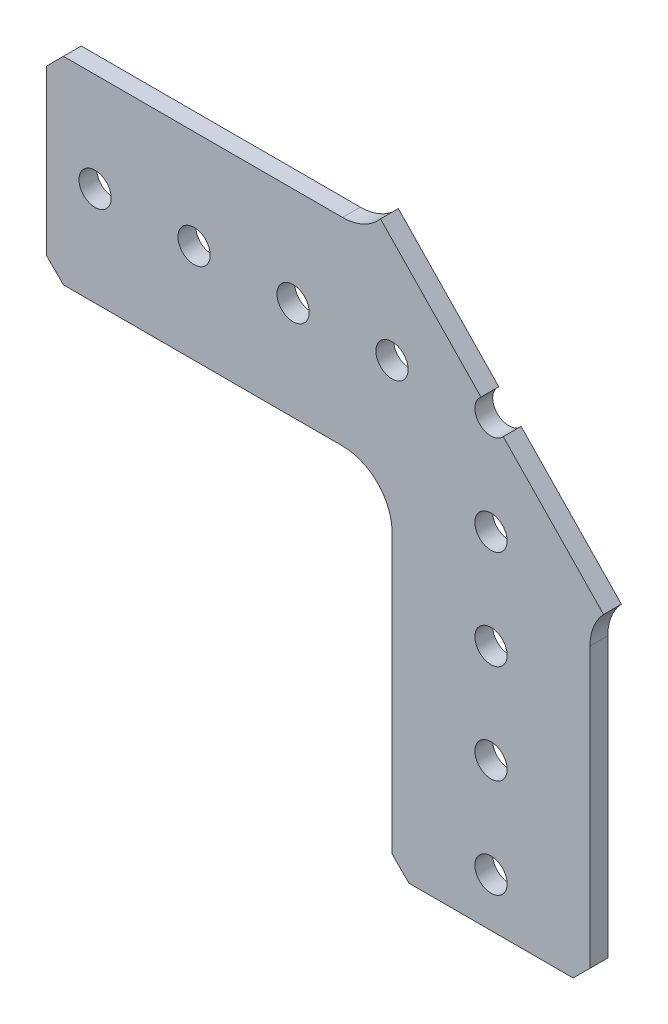
ISO-10303-21;
HEADER;
FILE_DESCRIPTION(('STEP AP214'),'2;1');
FILE_NAME('part.step','',(''),(''),'','','');
FILE_SCHEMA(('AUTOMOTIVE_DESIGN { 1 0 10303 214 1 1 1 1 }'));
ENDSEC;
DATA;
#1=APPLICATION_CONTEXT('core data for automotive mechanical design processes');
#2=APPLICATION_PROTOCOL_DEFINITION('international standard','automotive_design',2000,#1);
#3=PRODUCT_CONTEXT('',#1,'mechanical');
#4=PRODUCT('Part','Part','',(#3));
#5=PRODUCT_RELATED_PRODUCT_CATEGORY('part','',(#4));
#6=PRODUCT_DEFINITION_FORMATION('','',#4);
#7=PRODUCT_DEFINITION_CONTEXT('part definition',#1,'design');
#8=PRODUCT_DEFINITION('design','',#6,#7);
#9=PRODUCT_DEFINITION_SHAPE('','',#8);
#10=(LENGTH_UNIT() NAMED_UNIT(*) SI_UNIT(.MILLI.,.METRE.));
#11=(NAMED_UNIT(*) PLANE_ANGLE_UNIT() SI_UNIT($,.RADIAN.));
#12=(NAMED_UNIT(*) SI_UNIT($,.STERADIAN.) SOLID_ANGLE_UNIT());
#13=UNCERTAINTY_MEASURE_WITH_UNIT(LENGTH_MEASURE(1.E-05),#10,'distance_accuracy_value','');
#14=(GEOMETRIC_REPRESENTATION_CONTEXT(3) GLOBAL_UNCERTAINTY_ASSIGNED_CONTEXT((#13)) GLOBAL_UNIT_ASSIGNED_CONTEXT((#10,
#11,#12)) REPRESENTATION_CONTEXT('',''));
#15=CARTESIAN_POINT('',(0.,0.,0.));
#16=DIRECTION('',(0.,0.,1.));
#17=DIRECTION('',(1.,0.,0.));
#18=AXIS2_PLACEMENT_3D('',#15,#16,#17);
#19=CARTESIAN_POINT('',(69.723,0.,2.286));
#20=DIRECTION('',(0.,0.,-1.));
#21=DIRECTION('',(-1.,0.,0.));
#22=AXIS2_PLACEMENT_3D('',#19,#20,#21);
#23=PLANE('',#22);
#24=CARTESIAN_POINT('',(-12.7,0.,2.286));
#25=DIRECTION('',(0.,0.,-1.));
#26=DIRECTION('',(-1.,0.,0.));
#27=AXIS2_PLACEMENT_3D('',#24,#25,#26);
#28=CIRCLE('',#27,2.0701);
#29=CARTESIAN_POINT('',(-14.7701,0.,2.286));
#30=VERTEX_POINT('',#29);
#31=EDGE_CURVE('E184',#30,#30,#28,.T.);
#32=ORIENTED_EDGE('',*,*,#31,.T.);
#33=EDGE_LOOP('',(#32));
#34=FACE_BOUND('',#33,.T.);
#35=CARTESIAN_POINT('',(-38.1,0.,2.286));
#36=DIRECTION('',(0.,0.,-1.));
#37=DIRECTION('',(-1.,0.,0.));
#38=AXIS2_PLACEMENT_3D('',#35,#36,#37);
#39=CIRCLE('',#38,2.0701);
#40=CARTESIAN_POINT('',(-40.1701,0.,2.286));
#41=VERTEX_POINT('',#40);
#42=EDGE_CURVE('E187',#41,#41,#39,.T.);
#43=ORIENTED_EDGE('',*,*,#42,.T.);
#44=EDGE_LOOP('',(#43));
#45=FACE_BOUND('',#44,.T.);
#46=CARTESIAN_POINT('',(3.9907631702977E-13,-38.1,2.286));
#47=DIRECTION('',(0.,0.,-1.));
#48=DIRECTION('',(-1.,0.,0.));
#49=AXIS2_PLACEMENT_3D('',#46,#47,#48);
#50=CIRCLE('',#49,2.0701);
#51=CARTESIAN_POINT('',(-2.0700999999996,-38.1,2.286));
#52=VERTEX_POINT('',#51);
#53=EDGE_CURVE('E190',#52,#52,#50,.T.);
#54=ORIENTED_EDGE('',*,*,#53,.T.);
#55=EDGE_LOOP('',(#54));
#56=FACE_BOUND('',#55,.T.);
#57=CARTESIAN_POINT('',(1.33025439009923E-13,-12.7,2.286));
#58=DIRECTION('',(0.,0.,-1.));
#59=DIRECTION('',(-1.,0.,0.));
#60=AXIS2_PLACEMENT_3D('',#57,#58,#59);
#61=CIRCLE('',#60,2.0701);
#62=CARTESIAN_POINT('',(-2.07009999999987,-12.7,2.286));
#63=VERTEX_POINT('',#62);
#64=EDGE_CURVE('E193',#63,#63,#61,.T.);
#65=ORIENTED_EDGE('',*,*,#64,.T.);
#66=EDGE_LOOP('',(#65));
#67=FACE_BOUND('',#66,.T.);
#68=CARTESIAN_POINT('',(19.05,-19.05,2.286));
#69=DIRECTION('',(0.,0.,1.));
#70=DIRECTION('',(1.,0.,0.));
#71=AXIS2_PLACEMENT_3D('',#68,#69,#70);
#72=CIRCLE('',#71,6.35000000000001);
#73=CARTESIAN_POINT('',(12.7,-19.05,2.286));
#74=VERTEX_POINT('',#73);
#75=CARTESIAN_POINT('',(14.4449223077904,-14.6778427008267,2.286));
#76=VERTEX_POINT('',#75);
#77=EDGE_CURVE('E181',#74,#76,#72,.F.);
#78=ORIENTED_EDGE('',*,*,#77,.T.);
#79=DIRECTION('',(0.694505341103961,-0.719487547618492,0.));
#80=VECTOR('',#79,1.);
#81=CARTESIAN_POINT('',(-45.3800796503522,47.2991377450189,2.286));
#82=LINE('',#81,#80);
#83=CARTESIAN_POINT('',(1.57428143612047,-1.34422913593125,2.286));
#84=VERTEX_POINT('',#83);
#85=EDGE_CURVE('E162',#84,#76,#82,.T.);
#86=ORIENTED_EDGE('',*,*,#85,.F.);
#87=CARTESIAN_POINT('',(0.,0.,2.286));
#88=DIRECTION('',(0.,0.,-1.));
#89=DIRECTION('',(-1.,0.,0.));
#90=AXIS2_PLACEMENT_3D('',#87,#88,#89);
#91=CIRCLE('',#90,2.0701);
#92=CARTESIAN_POINT('',(-1.28777922803728,1.62078335067821,2.286));
#93=VERTEX_POINT('',#92);
#94=EDGE_CURVE('E161',#84,#93,#91,.T.);
#95=ORIENTED_EDGE('',*,*,#94,.T.);
#96=CARTESIAN_POINT('',(-14.1792157014069,14.9759405605,2.286));
#97=VERTEX_POINT('',#96);
#98=EDGE_CURVE('E146',#97,#93,#82,.T.);
#99=ORIENTED_EDGE('',*,*,#98,.F.);
#100=CARTESIAN_POINT('',(-19.05,19.05,2.286));
#101=DIRECTION('',(0.,0.,1.));
#102=DIRECTION('',(1.,0.,0.));
#103=AXIS2_PLACEMENT_3D('',#100,#101,#102);
#104=CIRCLE('',#103,6.35000000000001);
#105=CARTESIAN_POINT('',(-19.05,12.7,2.286));
#106=VERTEX_POINT('',#105);
#107=EDGE_CURVE('E157',#97,#106,#104,.F.);
#108=ORIENTED_EDGE('',*,*,#107,.T.);
#109=DIRECTION('',(1.,0.,0.));
#110=VECTOR('',#109,1.);
#111=CARTESIAN_POINT('',(0.,12.7,2.286));
#112=LINE('',#111,#110);
#113=CARTESIAN_POINT('',(-54.864,12.7,2.286));
#114=VERTEX_POINT('',#113);
#115=EDGE_CURVE('E172',#114,#106,#112,.T.);
#116=ORIENTED_EDGE('',*,*,#115,.F.);
#117=DIRECTION('',(-0.707106781186548,-0.707106781186548,0.));
#118=VECTOR('',#117,1.);
#119=CARTESIAN_POINT('',(-57.023,10.541,2.286));
#120=LINE('',#119,#118);
#121=CARTESIAN_POINT('',(-57.023,10.541,2.286));
#122=VERTEX_POINT('',#121);
#123=EDGE_CURVE('E258',#122,#114,#120,.F.);
#124=ORIENTED_EDGE('',*,*,#123,.F.);
#125=DIRECTION('',(0.,1.,0.));
#126=VECTOR('',#125,1.);
#127=CARTESIAN_POINT('',(-57.023,-12.7,2.286));
#128=LINE('',#127,#126);
#129=CARTESIAN_POINT('',(-57.023,-10.5409999999998,2.286));
#130=VERTEX_POINT('',#129);
#131=EDGE_CURVE('E267',#122,#130,#128,.F.);
#132=ORIENTED_EDGE('',*,*,#131,.T.);
#133=DIRECTION('',(-0.707106781186547,0.707106781186548,0.));
#134=VECTOR('',#133,1.);
#135=CARTESIAN_POINT('',(-54.864,-12.6999999999998,2.286));
#136=LINE('',#135,#134);
#137=CARTESIAN_POINT('',(-54.864,-12.6999999999998,2.286));
#138=VERTEX_POINT('',#137);
#139=EDGE_CURVE('E276',#130,#138,#136,.F.);
#140=ORIENTED_EDGE('',*,*,#139,.T.);
#141=DIRECTION('',(-1.,0.,0.));
#142=VECTOR('',#141,1.);
#143=CARTESIAN_POINT('',(0.,-12.7,2.286));
#144=LINE('',#143,#142);
#145=CARTESIAN_POINT('',(-19.05,-12.6999999999999,2.286));
#146=VERTEX_POINT('',#145);
#147=EDGE_CURVE('E277',#138,#146,#144,.F.);
#148=ORIENTED_EDGE('',*,*,#147,.T.);
#149=CARTESIAN_POINT('',(-19.0500000000001,-19.0499999999999,2.286));
#150=DIRECTION('',(0.,0.,1.));
#151=DIRECTION('',(1.,0.,0.));
#152=AXIS2_PLACEMENT_3D('',#149,#150,#151);
#153=CIRCLE('',#152,6.35000000000001);
#154=CARTESIAN_POINT('',(-12.7,-19.0499999999999,2.286));
#155=VERTEX_POINT('',#154);
#156=EDGE_CURVE('E176',#146,#155,#153,.F.);
#157=ORIENTED_EDGE('',*,*,#156,.T.);
#158=DIRECTION('',(0.,-1.,0.));
#159=VECTOR('',#158,1.);
#160=CARTESIAN_POINT('',(-12.7,0.,2.286));
#161=LINE('',#160,#159);
#162=CARTESIAN_POINT('',(-12.7000000000002,-54.864,2.286));
#163=VERTEX_POINT('',#162);
#164=EDGE_CURVE('E282',#163,#155,#161,.F.);
#165=ORIENTED_EDGE('',*,*,#164,.F.);
#166=DIRECTION('',(0.707106781186546,-0.707106781186549,0.));
#167=VECTOR('',#166,1.);
#168=CARTESIAN_POINT('',(-10.5410000000002,-57.023,2.286));
#169=LINE('',#168,#167);
#170=CARTESIAN_POINT('',(-10.5410000000002,-57.023,2.286));
#171=VERTEX_POINT('',#170);
#172=EDGE_CURVE('E296',#171,#163,#169,.F.);
#173=ORIENTED_EDGE('',*,*,#172,.F.);
#174=DIRECTION('',(-1.,0.,0.));
#175=VECTOR('',#174,1.);
#176=CARTESIAN_POINT('',(12.7,-57.023,2.286));
#177=LINE('',#176,#175);
#178=CARTESIAN_POINT('',(10.541,-57.023,2.286));
#179=VERTEX_POINT('',#178);
#180=EDGE_CURVE('E305',#171,#179,#177,.F.);
#181=ORIENTED_EDGE('',*,*,#180,.T.);
#182=DIRECTION('',(-0.707106781186547,-0.707106781186548,0.));
#183=VECTOR('',#182,1.);
#184=CARTESIAN_POINT('',(12.7,-54.864,2.286));
#185=LINE('',#184,#183);
#186=CARTESIAN_POINT('',(12.7,-54.864,2.286));
#187=VERTEX_POINT('',#186);
#188=EDGE_CURVE('E314',#179,#187,#185,.F.);
#189=ORIENTED_EDGE('',*,*,#188,.T.);
#190=DIRECTION('',(0.,-1.,0.));
#191=VECTOR('',#190,1.);
#192=CARTESIAN_POINT('',(12.7,0.,2.286));
#193=LINE('',#192,#191);
#194=EDGE_CURVE('E315',#187,#74,#193,.F.);
#195=ORIENTED_EDGE('',*,*,#194,.T.);
#196=EDGE_LOOP('',(#78,#86,#95,#99,#108,#116,#124,#132,#140,#148,#157,#165,#173,#181,#189,#195));
#197=FACE_BOUND('',#196,.T.);
#198=CARTESIAN_POINT('',(2.66050878019847E-13,-25.4,2.286));
#199=DIRECTION('',(0.,0.,-1.));
#200=DIRECTION('',(-1.,0.,0.));
#201=AXIS2_PLACEMENT_3D('',#198,#199,#200);
#202=CIRCLE('',#201,2.0701);
#203=CARTESIAN_POINT('',(-2.07009999999973,-25.4,2.286));
#204=VERTEX_POINT('',#203);
#205=EDGE_CURVE('E197',#204,#204,#202,.T.);
#206=ORIENTED_EDGE('',*,*,#205,.T.);
#207=EDGE_LOOP('',(#206));
#208=FACE_BOUND('',#207,.T.);
#209=CARTESIAN_POINT('',(0.,-50.8,2.286));
#210=DIRECTION('',(0.,0.,-1.));
#211=DIRECTION('',(-1.,0.,0.));
#212=AXIS2_PLACEMENT_3D('',#209,#210,#211);
#213=CIRCLE('',#212,2.0701);
#214=CARTESIAN_POINT('',(-2.07009999999999,-50.8,2.286));
#215=VERTEX_POINT('',#214);
#216=EDGE_CURVE('E200',#215,#215,#213,.T.);
#217=ORIENTED_EDGE('',*,*,#216,.T.);
#218=EDGE_LOOP('',(#217));
#219=FACE_BOUND('',#218,.T.);
#220=CARTESIAN_POINT('',(-50.8,0.,2.286));
#221=DIRECTION('',(0.,0.,-1.));
#222=DIRECTION('',(-1.,0.,0.));
#223=AXIS2_PLACEMENT_3D('',#220,#221,#222);
#224=CIRCLE('',#223,2.0701);
#225=CARTESIAN_POINT('',(-52.8701,0.,2.286));
#226=VERTEX_POINT('',#225);
#227=EDGE_CURVE('E203',#226,#226,#224,.T.);
#228=ORIENTED_EDGE('',*,*,#227,.T.);
#229=EDGE_LOOP('',(#228));
#230=FACE_BOUND('',#229,.T.);
#231=CARTESIAN_POINT('',(-25.4,0.,2.286));
#232=DIRECTION('',(0.,0.,-1.));
#233=DIRECTION('',(-1.,0.,0.));
#234=AXIS2_PLACEMENT_3D('',#231,#232,#233);
#235=CIRCLE('',#234,2.0701);
#236=CARTESIAN_POINT('',(-27.4701,0.,2.286));
#237=VERTEX_POINT('',#236);
#238=EDGE_CURVE('E205',#237,#237,#235,.T.);
#239=ORIENTED_EDGE('',*,*,#238,.T.);
#240=EDGE_LOOP('',(#239));
#241=FACE_BOUND('',#240,.T.);
#242=ADVANCED_FACE('F34',(#34,#45,#56,#67,#197,#208,#219,#230,#241),#23,.F.);
#243=CARTESIAN_POINT('',(-25.4,0.,2.286));
#244=DIRECTION('',(0.,0.,-1.));
#245=DIRECTION('',(-1.,0.,0.));
#246=AXIS2_PLACEMENT_3D('',#243,#244,#245);
#247=CYLINDRICAL_SURFACE('',#246,2.0701);
#248=ORIENTED_EDGE('',*,*,#238,.F.);
#249=EDGE_LOOP('',(#248));
#250=FACE_BOUND('',#249,.T.);
#251=CARTESIAN_POINT('',(-25.4,0.,0.));
#252=DIRECTION('',(0.,0.,-1.));
#253=DIRECTION('',(-1.,0.,0.));
#254=AXIS2_PLACEMENT_3D('',#251,#252,#253);
#255=CIRCLE('',#254,2.0701);
#256=CARTESIAN_POINT('',(-27.4701,0.,0.));
#257=VERTEX_POINT('',#256);
#258=EDGE_CURVE('E167',#257,#257,#255,.F.);
#259=ORIENTED_EDGE('',*,*,#258,.F.);
#260=EDGE_LOOP('',(#259));
#261=FACE_BOUND('',#260,.T.);
#262=ADVANCED_FACE('F386',(#250,#261),#247,.F.);
#263=CARTESIAN_POINT('',(-50.8,0.,2.286));
#264=DIRECTION('',(0.,0.,-1.));
#265=DIRECTION('',(-1.,0.,0.));
#266=AXIS2_PLACEMENT_3D('',#263,#264,#265);
#267=CYLINDRICAL_SURFACE('',#266,2.0701);
#268=ORIENTED_EDGE('',*,*,#227,.F.);
#269=EDGE_LOOP('',(#268));
#270=FACE_BOUND('',#269,.T.);
#271=CARTESIAN_POINT('',(-50.8,0.,0.));
#272=DIRECTION('',(0.,0.,-1.));
#273=DIRECTION('',(-1.,0.,0.));
#274=AXIS2_PLACEMENT_3D('',#271,#272,#273);
#275=CIRCLE('',#274,2.0701);
#276=CARTESIAN_POINT('',(-52.8701,0.,0.));
#277=VERTEX_POINT('',#276);
#278=EDGE_CURVE('E170',#277,#277,#275,.F.);
#279=ORIENTED_EDGE('',*,*,#278,.F.);
#280=EDGE_LOOP('',(#279));
#281=FACE_BOUND('',#280,.T.);
#282=ADVANCED_FACE('F383',(#270,#281),#267,.F.);
#283=CARTESIAN_POINT('',(0.,-50.8,2.286));
#284=DIRECTION('',(0.,0.,-1.));
#285=DIRECTION('',(-1.,0.,0.));
#286=AXIS2_PLACEMENT_3D('',#283,#284,#285);
#287=CYLINDRICAL_SURFACE('',#286,2.0701);
#288=ORIENTED_EDGE('',*,*,#216,.F.);
#289=EDGE_LOOP('',(#288));
#290=FACE_BOUND('',#289,.T.);
#291=CARTESIAN_POINT('',(0.,-50.8,0.));
#292=DIRECTION('',(0.,0.,-1.));
#293=DIRECTION('',(-1.,0.,0.));
#294=AXIS2_PLACEMENT_3D('',#291,#292,#293);
#295=CIRCLE('',#294,2.0701);
#296=CARTESIAN_POINT('',(-2.07009999999999,-50.8,0.));
#297=VERTEX_POINT('',#296);
#298=EDGE_CURVE('E375',#297,#297,#295,.F.);
#299=ORIENTED_EDGE('',*,*,#298,.F.);
#300=EDGE_LOOP('',(#299));
#301=FACE_BOUND('',#300,.T.);
#302=ADVANCED_FACE('F385',(#290,#301),#287,.F.);
#303=CARTESIAN_POINT('',(2.66050878019847E-13,-25.4,2.286));
#304=DIRECTION('',(0.,0.,-1.));
#305=DIRECTION('',(-1.,0.,0.));
#306=AXIS2_PLACEMENT_3D('',#303,#304,#305);
#307=CYLINDRICAL_SURFACE('',#306,2.0701);
#308=ORIENTED_EDGE('',*,*,#205,.F.);
#309=EDGE_LOOP('',(#308));
#310=FACE_BOUND('',#309,.T.);
#311=CARTESIAN_POINT('',(2.66050878019847E-13,-25.4,0.));
#312=DIRECTION('',(0.,0.,-1.));
#313=DIRECTION('',(-1.,0.,0.));
#314=AXIS2_PLACEMENT_3D('',#311,#312,#313);
#315=CIRCLE('',#314,2.0701);
#316=CARTESIAN_POINT('',(-2.07009999999973,-25.4,0.));
#317=VERTEX_POINT('',#316);
#318=EDGE_CURVE('E372',#317,#317,#315,.F.);
#319=ORIENTED_EDGE('',*,*,#318,.F.);
#320=EDGE_LOOP('',(#319));
#321=FACE_BOUND('',#320,.T.);
#322=ADVANCED_FACE('F394',(#310,#321),#307,.F.);
#323=CARTESIAN_POINT('',(0.,0.,2.286));
#324=DIRECTION('',(0.,0.,-1.));
#325=DIRECTION('',(-1.,0.,0.));
#326=AXIS2_PLACEMENT_3D('',#323,#324,#325);
#327=CYLINDRICAL_SURFACE('',#326,2.0701);
#328=CARTESIAN_POINT('',(0.,0.,0.));
#329=DIRECTION('',(0.,0.,-1.));
#330=DIRECTION('',(-1.,0.,0.));
#331=AXIS2_PLACEMENT_3D('',#328,#329,#330);
#332=CIRCLE('',#331,2.0701);
#333=CARTESIAN_POINT('',(-1.2877792280373,1.6207833506782,0.));
#334=VERTEX_POINT('',#333);
#335=CARTESIAN_POINT('',(1.57428143612045,-1.34422913593127,0.));
#336=VERTEX_POINT('',#335);
#337=EDGE_CURVE('E370',#334,#336,#332,.F.);
#338=ORIENTED_EDGE('',*,*,#337,.F.);
#339=DIRECTION('',(0.,0.,-1.));
#340=VECTOR('',#339,1.);
#341=CARTESIAN_POINT('',(-1.28777922803729,1.62078335067821,2.286));
#342=LINE('',#341,#340);
#343=EDGE_CURVE('E48',#334,#93,#342,.F.);
#344=ORIENTED_EDGE('',*,*,#343,.T.);
#345=ORIENTED_EDGE('',*,*,#94,.F.);
#346=DIRECTION('',(0.,0.,-1.));
#347=VECTOR('',#346,1.);
#348=CARTESIAN_POINT('',(1.57428143612046,-1.34422913593126,2.286));
#349=LINE('',#348,#347);
#350=EDGE_CURVE('E207',#84,#336,#349,.T.);
#351=ORIENTED_EDGE('',*,*,#350,.T.);
#352=EDGE_LOOP('',(#338,#344,#345,#351));
#353=FACE_BOUND('',#352,.T.);
#354=ADVANCED_FACE('F475',(#353),#327,.F.);
#355=CARTESIAN_POINT('',(1.33025439009923E-13,-12.7,2.286));
#356=DIRECTION('',(0.,0.,-1.));
#357=DIRECTION('',(-1.,0.,0.));
#358=AXIS2_PLACEMENT_3D('',#355,#356,#357);
#359=CYLINDRICAL_SURFACE('',#358,2.0701);
#360=ORIENTED_EDGE('',*,*,#64,.F.);
#361=EDGE_LOOP('',(#360));
#362=FACE_BOUND('',#361,.T.);
#363=CARTESIAN_POINT('',(1.33025439009923E-13,-12.7,0.));
#364=DIRECTION('',(0.,0.,-1.));
#365=DIRECTION('',(-1.,0.,0.));
#366=AXIS2_PLACEMENT_3D('',#363,#364,#365);
#367=CIRCLE('',#366,2.0701);
#368=CARTESIAN_POINT('',(-2.07009999999987,-12.7,0.));
#369=VERTEX_POINT('',#368);
#370=EDGE_CURVE('E367',#369,#369,#367,.F.);
#371=ORIENTED_EDGE('',*,*,#370,.F.);
#372=EDGE_LOOP('',(#371));
#373=FACE_BOUND('',#372,.T.);
#374=ADVANCED_FACE('F471',(#362,#373),#359,.F.);
#375=CARTESIAN_POINT('',(3.9907631702977E-13,-38.1,2.286));
#376=DIRECTION('',(0.,0.,-1.));
#377=DIRECTION('',(-1.,0.,0.));
#378=AXIS2_PLACEMENT_3D('',#375,#376,#377);
#379=CYLINDRICAL_SURFACE('',#378,2.0701);
#380=ORIENTED_EDGE('',*,*,#53,.F.);
#381=EDGE_LOOP('',(#380));
#382=FACE_BOUND('',#381,.T.);
#383=CARTESIAN_POINT('',(3.9907631702977E-13,-38.1,0.));
#384=DIRECTION('',(0.,0.,-1.));
#385=DIRECTION('',(-1.,0.,0.));
#386=AXIS2_PLACEMENT_3D('',#383,#384,#385);
#387=CIRCLE('',#386,2.0701);
#388=CARTESIAN_POINT('',(-2.0700999999996,-38.1,0.));
#389=VERTEX_POINT('',#388);
#390=EDGE_CURVE('E364',#389,#389,#387,.F.);
#391=ORIENTED_EDGE('',*,*,#390,.F.);
#392=EDGE_LOOP('',(#391));
#393=FACE_BOUND('',#392,.T.);
#394=ADVANCED_FACE('F467',(#382,#393),#379,.F.);
#395=CARTESIAN_POINT('',(-38.1,0.,2.286));
#396=DIRECTION('',(0.,0.,-1.));
#397=DIRECTION('',(-1.,0.,0.));
#398=AXIS2_PLACEMENT_3D('',#395,#396,#397);
#399=CYLINDRICAL_SURFACE('',#398,2.0701);
#400=ORIENTED_EDGE('',*,*,#42,.F.);
#401=EDGE_LOOP('',(#400));
#402=FACE_BOUND('',#401,.T.);
#403=CARTESIAN_POINT('',(-38.1,0.,0.));
#404=DIRECTION('',(0.,0.,-1.));
#405=DIRECTION('',(-1.,0.,0.));
#406=AXIS2_PLACEMENT_3D('',#403,#404,#405);
#407=CIRCLE('',#406,2.0701);
#408=CARTESIAN_POINT('',(-40.1701,0.,0.));
#409=VERTEX_POINT('',#408);
#410=EDGE_CURVE('E361',#409,#409,#407,.F.);
#411=ORIENTED_EDGE('',*,*,#410,.F.);
#412=EDGE_LOOP('',(#411));
#413=FACE_BOUND('',#412,.T.);
#414=ADVANCED_FACE('F463',(#402,#413),#399,.F.);
#415=CARTESIAN_POINT('',(-12.7,0.,2.286));
#416=DIRECTION('',(0.,0.,-1.));
#417=DIRECTION('',(-1.,0.,0.));
#418=AXIS2_PLACEMENT_3D('',#415,#416,#417);
#419=CYLINDRICAL_SURFACE('',#418,2.0701);
#420=ORIENTED_EDGE('',*,*,#31,.F.);
#421=EDGE_LOOP('',(#420));
#422=FACE_BOUND('',#421,.T.);
#423=CARTESIAN_POINT('',(-12.7,0.,0.));
#424=DIRECTION('',(0.,0.,-1.));
#425=DIRECTION('',(-1.,0.,0.));
#426=AXIS2_PLACEMENT_3D('',#423,#424,#425);
#427=CIRCLE('',#426,2.0701);
#428=CARTESIAN_POINT('',(-14.7701,0.,0.));
#429=VERTEX_POINT('',#428);
#430=EDGE_CURVE('E358',#429,#429,#427,.F.);
#431=ORIENTED_EDGE('',*,*,#430,.F.);
#432=EDGE_LOOP('',(#431));
#433=FACE_BOUND('',#432,.T.);
#434=ADVANCED_FACE('F459',(#422,#433),#419,.F.);
#435=CARTESIAN_POINT('',(19.05,-19.05,0.));
#436=DIRECTION('',(0.,0.,1.));
#437=DIRECTION('',(1.,0.,0.));
#438=AXIS2_PLACEMENT_3D('',#435,#436,#437);
#439=CYLINDRICAL_SURFACE('',#438,6.35000000000001);
#440=CARTESIAN_POINT('',(19.05,-19.05,0.));
#441=DIRECTION('',(0.,0.,1.));
#442=DIRECTION('',(1.,0.,0.));
#443=AXIS2_PLACEMENT_3D('',#440,#441,#442);
#444=CIRCLE('',#443,6.35000000000001);
#445=CARTESIAN_POINT('',(14.4449223077904,-14.6778427008268,0.));
#446=VERTEX_POINT('',#445);
#447=CARTESIAN_POINT('',(12.7,-19.05,0.));
#448=VERTEX_POINT('',#447);
#449=EDGE_CURVE('E242',#446,#448,#444,.T.);
#450=ORIENTED_EDGE('',*,*,#449,.F.);
#451=DIRECTION('',(0.,0.,1.));
#452=VECTOR('',#451,1.);
#453=CARTESIAN_POINT('',(14.4449223077904,-14.6778427008267,0.));
#454=LINE('',#453,#452);
#455=EDGE_CURVE('E55',#446,#76,#454,.T.);
#456=ORIENTED_EDGE('',*,*,#455,.T.);
#457=ORIENTED_EDGE('',*,*,#77,.F.);
#458=DIRECTION('',(0.,0.,1.));
#459=VECTOR('',#458,1.);
#460=CARTESIAN_POINT('',(12.7,-19.05,0.));
#461=LINE('',#460,#459);
#462=EDGE_CURVE('E183',#74,#448,#461,.F.);
#463=ORIENTED_EDGE('',*,*,#462,.T.);
#464=EDGE_LOOP('',(#450,#456,#457,#463));
#465=FACE_BOUND('',#464,.T.);
#466=ADVANCED_FACE('F455',(#465),#439,.F.);
#467=CARTESIAN_POINT('',(12.7,0.,0.));
#468=DIRECTION('',(-1.,0.,0.));
#469=DIRECTION('',(0.,-1.,0.));
#470=AXIS2_PLACEMENT_3D('',#467,#468,#469);
#471=PLANE('',#470);
#472=DIRECTION('',(0.,0.,1.));
#473=VECTOR('',#472,1.);
#474=CARTESIAN_POINT('',(12.7,-54.864,0.));
#475=LINE('',#474,#473);
#476=CARTESIAN_POINT('',(12.7,-54.864,0.));
#477=VERTEX_POINT('',#476);
#478=EDGE_CURVE('E312',#187,#477,#475,.F.);
#479=ORIENTED_EDGE('',*,*,#478,.T.);
#480=DIRECTION('',(0.,1.,0.));
#481=VECTOR('',#480,1.);
#482=CARTESIAN_POINT('',(12.7,0.,0.));
#483=LINE('',#482,#481);
#484=EDGE_CURVE('E238',#448,#477,#483,.F.);
#485=ORIENTED_EDGE('',*,*,#484,.F.);
#486=ORIENTED_EDGE('',*,*,#462,.F.);
#487=ORIENTED_EDGE('',*,*,#194,.F.);
#488=EDGE_LOOP('',(#479,#485,#486,#487));
#489=FACE_BOUND('',#488,.T.);
#490=ADVANCED_FACE('F451',(#489),#471,.F.);
#491=CARTESIAN_POINT('',(12.7,-54.864,0.));
#492=DIRECTION('',(-0.707106781186548,0.707106781186547,0.));
#493=DIRECTION('',(-0.707106781186547,-0.707106781186548,0.));
#494=AXIS2_PLACEMENT_3D('',#491,#492,#493);
#495=PLANE('',#494);
#496=DIRECTION('',(0.,0.,1.));
#497=VECTOR('',#496,1.);
#498=CARTESIAN_POINT('',(10.541,-57.023,2.286));
#499=LINE('',#498,#497);
#500=CARTESIAN_POINT('',(10.541,-57.023,0.));
#501=VERTEX_POINT('',#500);
#502=EDGE_CURVE('E303',#179,#501,#499,.F.);
#503=ORIENTED_EDGE('',*,*,#502,.T.);
#504=DIRECTION('',(-0.70710678118655,-0.707106781186545,0.));
#505=VECTOR('',#504,1.);
#506=CARTESIAN_POINT('',(12.7,-54.864,0.));
#507=LINE('',#506,#505);
#508=EDGE_CURVE('E241',#477,#501,#507,.T.);
#509=ORIENTED_EDGE('',*,*,#508,.F.);
#510=ORIENTED_EDGE('',*,*,#478,.F.);
#511=ORIENTED_EDGE('',*,*,#188,.F.);
#512=EDGE_LOOP('',(#503,#509,#510,#511));
#513=FACE_BOUND('',#512,.T.);
#514=ADVANCED_FACE('F447',(#513),#495,.F.);
#515=CARTESIAN_POINT('',(12.7,-57.023,2.286));
#516=DIRECTION('',(0.,1.,0.));
#517=DIRECTION('',(-1.,0.,0.));
#518=AXIS2_PLACEMENT_3D('',#515,#516,#517);
#519=PLANE('',#518);
#520=ORIENTED_EDGE('',*,*,#502,.F.);
#521=ORIENTED_EDGE('',*,*,#180,.F.);
#522=DIRECTION('',(0.,0.,1.));
#523=VECTOR('',#522,1.);
#524=CARTESIAN_POINT('',(-10.5410000000002,-57.023,2.286));
#525=LINE('',#524,#523);
#526=CARTESIAN_POINT('',(-10.5410000000002,-57.023,0.));
#527=VERTEX_POINT('',#526);
#528=EDGE_CURVE('E286',#527,#171,#525,.T.);
#529=ORIENTED_EDGE('',*,*,#528,.F.);
#530=DIRECTION('',(-1.,0.,0.));
#531=VECTOR('',#530,1.);
#532=CARTESIAN_POINT('',(69.723,-57.023,0.));
#533=LINE('',#532,#531);
#534=EDGE_CURVE('E291',#501,#527,#533,.T.);
#535=ORIENTED_EDGE('',*,*,#534,.F.);
#536=EDGE_LOOP('',(#520,#521,#529,#535));
#537=FACE_BOUND('',#536,.T.);
#538=ADVANCED_FACE('F443',(#537),#519,.F.);
#539=CARTESIAN_POINT('',(-10.5410000000002,-57.023,2.286));
#540=DIRECTION('',(-0.707106781186549,-0.707106781186546,0.));
#541=DIRECTION('',(0.707106781186546,-0.707106781186549,0.));
#542=AXIS2_PLACEMENT_3D('',#539,#540,#541);
#543=PLANE('',#542);
#544=DIRECTION('',(-0.707106781186548,0.707106781186548,0.));
#545=VECTOR('',#544,1.);
#546=CARTESIAN_POINT('',(-10.5410000000002,-57.023,0.));
#547=LINE('',#546,#545);
#548=CARTESIAN_POINT('',(-12.7000000000002,-54.864,0.));
#549=VERTEX_POINT('',#548);
#550=EDGE_CURVE('E235',#527,#549,#547,.T.);
#551=ORIENTED_EDGE('',*,*,#550,.F.);
#552=ORIENTED_EDGE('',*,*,#528,.T.);
#553=ORIENTED_EDGE('',*,*,#172,.T.);
#554=DIRECTION('',(0.,0.,1.));
#555=VECTOR('',#554,1.);
#556=CARTESIAN_POINT('',(-12.7000000000002,-54.864,0.));
#557=LINE('',#556,#555);
#558=EDGE_CURVE('E283',#549,#163,#557,.T.);
#559=ORIENTED_EDGE('',*,*,#558,.F.);
#560=EDGE_LOOP('',(#551,#552,#553,#559));
#561=FACE_BOUND('',#560,.T.);
#562=ADVANCED_FACE('F439',(#561),#543,.T.);
#563=CARTESIAN_POINT('',(-12.7,0.,0.));
#564=DIRECTION('',(-1.,0.,0.));
#565=DIRECTION('',(0.,-1.,0.));
#566=AXIS2_PLACEMENT_3D('',#563,#564,#565);
#567=PLANE('',#566);
#568=ORIENTED_EDGE('',*,*,#164,.T.);
#569=DIRECTION('',(0.,0.,1.));
#570=VECTOR('',#569,1.);
#571=CARTESIAN_POINT('',(-12.7,-19.0499999999999,0.));
#572=LINE('',#571,#570);
#573=CARTESIAN_POINT('',(-12.7000000000001,-19.0499999999999,0.));
#574=VERTEX_POINT('',#573);
#575=EDGE_CURVE('E180',#155,#574,#572,.F.);
#576=ORIENTED_EDGE('',*,*,#575,.T.);
#577=DIRECTION('',(0.,1.,0.));
#578=VECTOR('',#577,1.);
#579=CARTESIAN_POINT('',(-12.7000000000002,0.,0.));
#580=LINE('',#579,#578);
#581=EDGE_CURVE('E232',#549,#574,#580,.T.);
#582=ORIENTED_EDGE('',*,*,#581,.F.);
#583=ORIENTED_EDGE('',*,*,#558,.T.);
#584=EDGE_LOOP('',(#568,#576,#582,#583));
#585=FACE_BOUND('',#584,.T.);
#586=ADVANCED_FACE('F435',(#585),#567,.T.);
#587=CARTESIAN_POINT('',(-19.0500000000001,-19.0499999999999,0.));
#588=DIRECTION('',(0.,0.,1.));
#589=DIRECTION('',(1.,0.,0.));
#590=AXIS2_PLACEMENT_3D('',#587,#588,#589);
#591=CYLINDRICAL_SURFACE('',#590,6.35000000000001);
#592=DIRECTION('',(0.,0.,1.));
#593=VECTOR('',#592,1.);
#594=CARTESIAN_POINT('',(-19.05,-12.6999999999999,0.));
#595=LINE('',#594,#593);
#596=CARTESIAN_POINT('',(-19.05,-12.6999999999999,0.));
#597=VERTEX_POINT('',#596);
#598=EDGE_CURVE('E179',#146,#597,#595,.F.);
#599=ORIENTED_EDGE('',*,*,#598,.T.);
#600=CARTESIAN_POINT('',(-19.0500000000001,-19.0499999999999,0.));
#601=DIRECTION('',(0.,0.,1.));
#602=DIRECTION('',(1.,0.,0.));
#603=AXIS2_PLACEMENT_3D('',#600,#601,#602);
#604=CIRCLE('',#603,6.35000000000001);
#605=EDGE_CURVE('E229',#574,#597,#604,.T.);
#606=ORIENTED_EDGE('',*,*,#605,.F.);
#607=ORIENTED_EDGE('',*,*,#575,.F.);
#608=ORIENTED_EDGE('',*,*,#156,.F.);
#609=EDGE_LOOP('',(#599,#606,#607,#608));
#610=FACE_BOUND('',#609,.T.);
#611=ADVANCED_FACE('F431',(#610),#591,.F.);
#612=CARTESIAN_POINT('',(0.,-12.7,0.));
#613=DIRECTION('',(0.,1.,0.));
#614=DIRECTION('',(-1.,0.,0.));
#615=AXIS2_PLACEMENT_3D('',#612,#613,#614);
#616=PLANE('',#615);
#617=DIRECTION('',(0.,0.,1.));
#618=VECTOR('',#617,1.);
#619=CARTESIAN_POINT('',(-54.864,-12.6999999999998,0.));
#620=LINE('',#619,#618);
#621=CARTESIAN_POINT('',(-54.8639999999999,-12.6999999999999,0.));
#622=VERTEX_POINT('',#621);
#623=EDGE_CURVE('E274',#138,#622,#620,.F.);
#624=ORIENTED_EDGE('',*,*,#623,.T.);
#625=DIRECTION('',(-1.,0.,0.));
#626=VECTOR('',#625,1.);
#627=CARTESIAN_POINT('',(69.723,-12.6999999999999,0.));
#628=LINE('',#627,#626);
#629=EDGE_CURVE('E225',#597,#622,#628,.T.);
#630=ORIENTED_EDGE('',*,*,#629,.F.);
#631=ORIENTED_EDGE('',*,*,#598,.F.);
#632=ORIENTED_EDGE('',*,*,#147,.F.);
#633=EDGE_LOOP('',(#624,#630,#631,#632));
#634=FACE_BOUND('',#633,.T.);
#635=ADVANCED_FACE('F427',(#634),#616,.F.);
#636=CARTESIAN_POINT('',(-54.864,-12.6999999999998,0.));
#637=DIRECTION('',(0.707106781186548,0.707106781186547,0.));
#638=DIRECTION('',(-0.707106781186547,0.707106781186548,0.));
#639=AXIS2_PLACEMENT_3D('',#636,#637,#638);
#640=PLANE('',#639);
#641=DIRECTION('',(0.,0.,-1.));
#642=VECTOR('',#641,1.);
#643=CARTESIAN_POINT('',(-57.023,-10.5409999999998,2.286));
#644=LINE('',#643,#642);
#645=CARTESIAN_POINT('',(-57.023,-10.5409999999998,0.));
#646=VERTEX_POINT('',#645);
#647=EDGE_CURVE('E265',#130,#646,#644,.T.);
#648=ORIENTED_EDGE('',*,*,#647,.T.);
#649=DIRECTION('',(-0.70710678118655,0.707106781186545,0.));
#650=VECTOR('',#649,1.);
#651=CARTESIAN_POINT('',(-54.864,-12.6999999999998,0.));
#652=LINE('',#651,#650);
#653=EDGE_CURVE('E228',#622,#646,#652,.T.);
#654=ORIENTED_EDGE('',*,*,#653,.F.);
#655=ORIENTED_EDGE('',*,*,#623,.F.);
#656=ORIENTED_EDGE('',*,*,#139,.F.);
#657=EDGE_LOOP('',(#648,#654,#655,#656));
#658=FACE_BOUND('',#657,.T.);
#659=ADVANCED_FACE('F423',(#658),#640,.F.);
#660=CARTESIAN_POINT('',(-57.023,-12.7,2.286));
#661=DIRECTION('',(1.,0.,0.));
#662=DIRECTION('',(0.,0.,-1.));
#663=AXIS2_PLACEMENT_3D('',#660,#661,#662);
#664=PLANE('',#663);
#665=ORIENTED_EDGE('',*,*,#647,.F.);
#666=ORIENTED_EDGE('',*,*,#131,.F.);
#667=DIRECTION('',(0.,0.,1.));
#668=VECTOR('',#667,1.);
#669=CARTESIAN_POINT('',(-57.023,10.541,2.286));
#670=LINE('',#669,#668);
#671=CARTESIAN_POINT('',(-57.023,10.541,0.));
#672=VERTEX_POINT('',#671);
#673=EDGE_CURVE('E248',#672,#122,#670,.T.);
#674=ORIENTED_EDGE('',*,*,#673,.F.);
#675=DIRECTION('',(0.,1.,0.));
#676=VECTOR('',#675,1.);
#677=CARTESIAN_POINT('',(-57.023,0.,0.));
#678=LINE('',#677,#676);
#679=EDGE_CURVE('E253',#646,#672,#678,.T.);
#680=ORIENTED_EDGE('',*,*,#679,.F.);
#681=EDGE_LOOP('',(#665,#666,#674,#680));
#682=FACE_BOUND('',#681,.T.);
#683=ADVANCED_FACE('F419',(#682),#664,.F.);
#684=CARTESIAN_POINT('',(-57.023,10.541,2.286));
#685=DIRECTION('',(-0.707106781186548,0.707106781186548,0.));
#686=DIRECTION('',(-0.707106781186548,-0.707106781186548,0.));
#687=AXIS2_PLACEMENT_3D('',#684,#685,#686);
#688=PLANE('',#687);
#689=DIRECTION('',(0.707106781186544,0.707106781186552,0.));
#690=VECTOR('',#689,1.);
#691=CARTESIAN_POINT('',(-57.023,10.541,0.));
#692=LINE('',#691,#690);
#693=CARTESIAN_POINT('',(-54.864,12.7,0.));
#694=VERTEX_POINT('',#693);
#695=EDGE_CURVE('E222',#672,#694,#692,.T.);
#696=ORIENTED_EDGE('',*,*,#695,.F.);
#697=ORIENTED_EDGE('',*,*,#673,.T.);
#698=ORIENTED_EDGE('',*,*,#123,.T.);
#699=DIRECTION('',(0.,0.,1.));
#700=VECTOR('',#699,1.);
#701=CARTESIAN_POINT('',(-54.864,12.7,0.));
#702=LINE('',#701,#700);
#703=EDGE_CURVE('E245',#694,#114,#702,.T.);
#704=ORIENTED_EDGE('',*,*,#703,.F.);
#705=EDGE_LOOP('',(#696,#697,#698,#704));
#706=FACE_BOUND('',#705,.T.);
#707=ADVANCED_FACE('F415',(#706),#688,.T.);
#708=CARTESIAN_POINT('',(0.,12.7,0.));
#709=DIRECTION('',(0.,1.,0.));
#710=DIRECTION('',(0.,0.,1.));
#711=AXIS2_PLACEMENT_3D('',#708,#709,#710);
#712=PLANE('',#711);
#713=ORIENTED_EDGE('',*,*,#115,.T.);
#714=DIRECTION('',(0.,0.,1.));
#715=VECTOR('',#714,1.);
#716=CARTESIAN_POINT('',(-19.05,12.7,0.));
#717=LINE('',#716,#715);
#718=CARTESIAN_POINT('',(-19.05,12.7,0.));
#719=VERTEX_POINT('',#718);
#720=EDGE_CURVE('E166',#106,#719,#717,.F.);
#721=ORIENTED_EDGE('',*,*,#720,.T.);
#722=DIRECTION('',(-1.,0.,0.));
#723=VECTOR('',#722,1.);
#724=CARTESIAN_POINT('',(69.723,12.7,0.));
#725=LINE('',#724,#723);
#726=EDGE_CURVE('E218',#694,#719,#725,.F.);
#727=ORIENTED_EDGE('',*,*,#726,.F.);
#728=ORIENTED_EDGE('',*,*,#703,.T.);
#729=EDGE_LOOP('',(#713,#721,#727,#728));
#730=FACE_BOUND('',#729,.T.);
#731=ADVANCED_FACE('F409',(#730),#712,.T.);
#732=CARTESIAN_POINT('',(-19.05,19.05,0.));
#733=DIRECTION('',(0.,0.,1.));
#734=DIRECTION('',(1.,0.,0.));
#735=AXIS2_PLACEMENT_3D('',#732,#733,#734);
#736=CYLINDRICAL_SURFACE('',#735,6.35000000000001);
#737=ORIENTED_EDGE('',*,*,#107,.F.);
#738=DIRECTION('',(0.,0.,1.));
#739=VECTOR('',#738,1.);
#740=CARTESIAN_POINT('',(-14.1792157014069,14.9759405605,0.));
#741=LINE('',#740,#739);
#742=CARTESIAN_POINT('',(-14.1792157014069,14.9759405605,0.));
#743=VERTEX_POINT('',#742);
#744=EDGE_CURVE('E143',#97,#743,#741,.F.);
#745=ORIENTED_EDGE('',*,*,#744,.T.);
#746=CARTESIAN_POINT('',(-19.05,19.05,0.));
#747=DIRECTION('',(0.,0.,1.));
#748=DIRECTION('',(1.,0.,0.));
#749=AXIS2_PLACEMENT_3D('',#746,#747,#748);
#750=CIRCLE('',#749,6.35000000000001);
#751=EDGE_CURVE('E221',#719,#743,#750,.T.);
#752=ORIENTED_EDGE('',*,*,#751,.F.);
#753=ORIENTED_EDGE('',*,*,#720,.F.);
#754=EDGE_LOOP('',(#737,#745,#752,#753));
#755=FACE_BOUND('',#754,.T.);
#756=ADVANCED_FACE('F165',(#755),#736,.F.);
#757=CARTESIAN_POINT('',(69.723,0.,0.));
#758=DIRECTION('',(0.,0.,-1.));
#759=DIRECTION('',(-1.,0.,0.));
#760=AXIS2_PLACEMENT_3D('',#757,#758,#759);
#761=PLANE('',#760);
#762=DIRECTION('',(-0.694505341103961,0.719487547618492,0.));
#763=VECTOR('',#762,1.);
#764=CARTESIAN_POINT('',(33.7732803873129,-34.7014654594688,0.));
#765=LINE('',#764,#763);
#766=EDGE_CURVE('E11',#446,#336,#765,.T.);
#767=ORIENTED_EDGE('',*,*,#766,.F.);
#768=ORIENTED_EDGE('',*,*,#449,.T.);
#769=ORIENTED_EDGE('',*,*,#484,.T.);
#770=ORIENTED_EDGE('',*,*,#508,.T.);
#771=ORIENTED_EDGE('',*,*,#534,.T.);
#772=ORIENTED_EDGE('',*,*,#550,.T.);
#773=ORIENTED_EDGE('',*,*,#581,.T.);
#774=ORIENTED_EDGE('',*,*,#605,.T.);
#775=ORIENTED_EDGE('',*,*,#629,.T.);
#776=ORIENTED_EDGE('',*,*,#653,.T.);
#777=ORIENTED_EDGE('',*,*,#679,.T.);
#778=ORIENTED_EDGE('',*,*,#695,.T.);
#779=ORIENTED_EDGE('',*,*,#726,.T.);
#780=ORIENTED_EDGE('',*,*,#751,.T.);
#781=EDGE_CURVE('E37',#334,#743,#765,.T.);
#782=ORIENTED_EDGE('',*,*,#781,.F.);
#783=ORIENTED_EDGE('',*,*,#337,.T.);
#784=EDGE_LOOP('',(#767,#768,#769,#770,#771,#772,#773,#774,#775,#776,#777,#778,#779,#780,#782,#783));
#785=FACE_BOUND('',#784,.T.);
#786=ORIENTED_EDGE('',*,*,#430,.T.);
#787=EDGE_LOOP('',(#786));
#788=FACE_BOUND('',#787,.T.);
#789=ORIENTED_EDGE('',*,*,#410,.T.);
#790=EDGE_LOOP('',(#789));
#791=FACE_BOUND('',#790,.T.);
#792=ORIENTED_EDGE('',*,*,#390,.T.);
#793=EDGE_LOOP('',(#792));
#794=FACE_BOUND('',#793,.T.);
#795=ORIENTED_EDGE('',*,*,#370,.T.);
#796=EDGE_LOOP('',(#795));
#797=FACE_BOUND('',#796,.T.);
#798=ORIENTED_EDGE('',*,*,#318,.T.);
#799=EDGE_LOOP('',(#798));
#800=FACE_BOUND('',#799,.T.);
#801=ORIENTED_EDGE('',*,*,#298,.T.);
#802=EDGE_LOOP('',(#801));
#803=FACE_BOUND('',#802,.T.);
#804=ORIENTED_EDGE('',*,*,#278,.T.);
#805=EDGE_LOOP('',(#804));
#806=FACE_BOUND('',#805,.T.);
#807=ORIENTED_EDGE('',*,*,#258,.T.);
#808=EDGE_LOOP('',(#807));
#809=FACE_BOUND('',#808,.T.);
#810=ADVANCED_FACE('F380',(#785,#788,#791,#794,#797,#800,#803,#806,#809),#761,.T.);
#811=CARTESIAN_POINT('',(-45.3800796503522,47.2991377450189,-0.254));
#812=DIRECTION('',(-0.719487547618492,-0.694505341103961,0.));
#813=DIRECTION('',(0.694505341103961,-0.719487547618492,0.));
#814=AXIS2_PLACEMENT_3D('',#811,#812,#813);
#815=PLANE('',#814);
#816=ORIENTED_EDGE('',*,*,#781,.T.);
#817=ORIENTED_EDGE('',*,*,#744,.F.);
#818=ORIENTED_EDGE('',*,*,#98,.T.);
#819=ORIENTED_EDGE('',*,*,#343,.F.);
#820=EDGE_LOOP('',(#816,#817,#818,#819));
#821=FACE_BOUND('',#820,.T.);
#822=ADVANCED_FACE('F145',(#821),#815,.F.);
#823=ORIENTED_EDGE('',*,*,#85,.T.);
#824=ORIENTED_EDGE('',*,*,#455,.F.);
#825=ORIENTED_EDGE('',*,*,#766,.T.);
#826=ORIENTED_EDGE('',*,*,#350,.F.);
#827=EDGE_LOOP('',(#823,#824,#825,#826));
#828=FACE_BOUND('',#827,.T.);
#829=ADVANCED_FACE('F407',(#828),#815,.F.);
#830=CLOSED_SHELL('',(#242,#262,#282,#302,#322,#354,#374,#394,#414,#434,#466,#490,#514,#538,
#562,#586,#611,#635,#659,#683,#707,#731,#756,#810,#822,#829));
#831=MANIFOLD_SOLID_BREP('B2',#830);
#832=ADVANCED_BREP_SHAPE_REPRESENTATION('',(#18,#831),#14);
#833=SHAPE_DEFINITION_REPRESENTATION(#9,#832);
ENDSEC;
END-ISO-10303-21;
